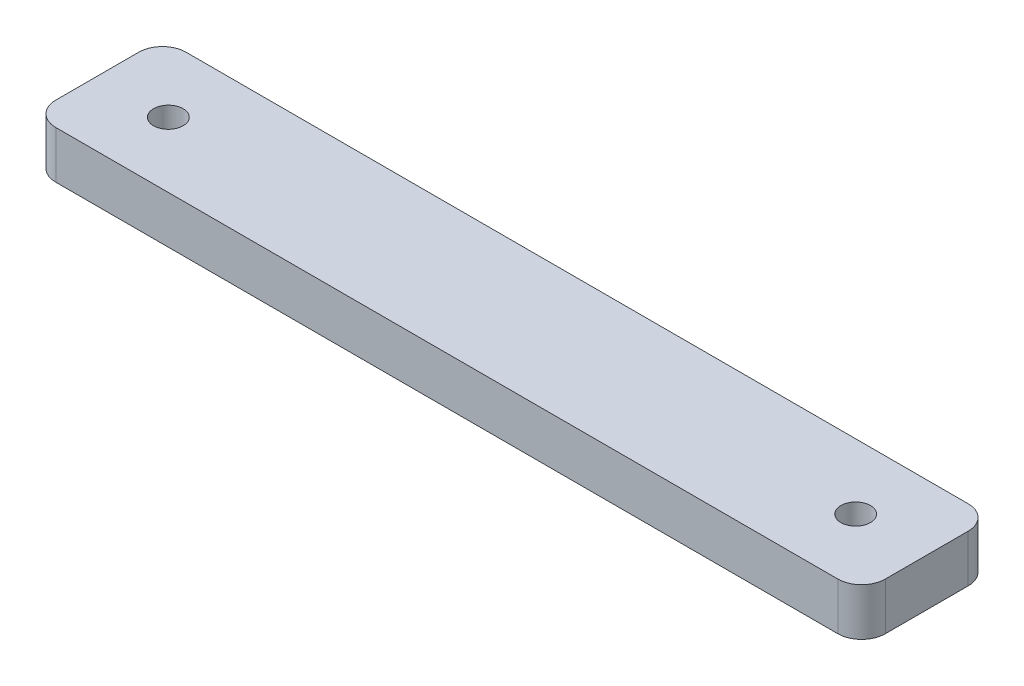
ISO-10303-21;
HEADER;
FILE_DESCRIPTION(('STEP AP214'),'2;1');
FILE_NAME('part.step','',(''),(''),'','','');
FILE_SCHEMA(('AUTOMOTIVE_DESIGN { 1 0 10303 214 1 1 1 1 }'));
ENDSEC;
DATA;
#1=APPLICATION_CONTEXT('core data for automotive mechanical design processes');
#2=APPLICATION_PROTOCOL_DEFINITION('international standard','automotive_design',2000,#1);
#3=PRODUCT_CONTEXT('',#1,'mechanical');
#4=PRODUCT('Part','Part','',(#3));
#5=PRODUCT_RELATED_PRODUCT_CATEGORY('part','',(#4));
#6=PRODUCT_DEFINITION_FORMATION('','',#4);
#7=PRODUCT_DEFINITION_CONTEXT('part definition',#1,'design');
#8=PRODUCT_DEFINITION('design','',#6,#7);
#9=PRODUCT_DEFINITION_SHAPE('','',#8);
#10=(LENGTH_UNIT() NAMED_UNIT(*) SI_UNIT(.MILLI.,.METRE.));
#11=(NAMED_UNIT(*) PLANE_ANGLE_UNIT() SI_UNIT($,.RADIAN.));
#12=(NAMED_UNIT(*) SI_UNIT($,.STERADIAN.) SOLID_ANGLE_UNIT());
#13=UNCERTAINTY_MEASURE_WITH_UNIT(LENGTH_MEASURE(1.E-05),#10,'distance_accuracy_value','');
#14=(GEOMETRIC_REPRESENTATION_CONTEXT(3) GLOBAL_UNCERTAINTY_ASSIGNED_CONTEXT((#13)) GLOBAL_UNIT_ASSIGNED_CONTEXT((#10,
#11,#12)) REPRESENTATION_CONTEXT('',''));
#15=CARTESIAN_POINT('',(0.,0.,0.));
#16=DIRECTION('',(0.,0.,1.));
#17=DIRECTION('',(1.,0.,0.));
#18=AXIS2_PLACEMENT_3D('',#15,#16,#17);
#19=CARTESIAN_POINT('',(0.,2.,0.));
#20=DIRECTION('',(0.,-1.,0.));
#21=DIRECTION('',(0.,0.,-1.));
#22=AXIS2_PLACEMENT_3D('',#19,#20,#21);
#23=PLANE('',#22);
#24=DIRECTION('',(0.,0.,-1.));
#25=VECTOR('',#24,1.);
#26=CARTESIAN_POINT('',(17.5,2.,2.75));
#27=LINE('',#26,#25);
#28=CARTESIAN_POINT('',(17.5,2.,1.75));
#29=VERTEX_POINT('',#28);
#30=CARTESIAN_POINT('',(17.5,2.,-1.75));
#31=VERTEX_POINT('',#30);
#32=EDGE_CURVE('E141',#29,#31,#27,.T.);
#33=ORIENTED_EDGE('',*,*,#32,.T.);
#34=CARTESIAN_POINT('',(16.5,2.,-1.75));
#35=DIRECTION('',(0.,-1.,0.));
#36=DIRECTION('',(0.,0.,-1.));
#37=AXIS2_PLACEMENT_3D('',#34,#35,#36);
#38=CIRCLE('',#37,1.);
#39=CARTESIAN_POINT('',(16.5,2.,-2.75));
#40=VERTEX_POINT('',#39);
#41=EDGE_CURVE('E155',#31,#40,#38,.F.);
#42=ORIENTED_EDGE('',*,*,#41,.T.);
#43=DIRECTION('',(-1.,0.,0.));
#44=VECTOR('',#43,1.);
#45=CARTESIAN_POINT('',(-17.5,2.,-2.75));
#46=LINE('',#45,#44);
#47=CARTESIAN_POINT('',(-16.5,2.,-2.75));
#48=VERTEX_POINT('',#47);
#49=EDGE_CURVE('E122',#40,#48,#46,.T.);
#50=ORIENTED_EDGE('',*,*,#49,.T.);
#51=CARTESIAN_POINT('',(-16.5,2.,-1.75));
#52=DIRECTION('',(0.,-1.,0.));
#53=DIRECTION('',(0.,0.,-1.));
#54=AXIS2_PLACEMENT_3D('',#51,#52,#53);
#55=CIRCLE('',#54,1.);
#56=CARTESIAN_POINT('',(-17.5,2.,-1.75));
#57=VERTEX_POINT('',#56);
#58=EDGE_CURVE('E151',#48,#57,#55,.F.);
#59=ORIENTED_EDGE('',*,*,#58,.T.);
#60=DIRECTION('',(0.,0.,1.));
#61=VECTOR('',#60,1.);
#62=CARTESIAN_POINT('',(-17.5,2.,2.75));
#63=LINE('',#62,#61);
#64=CARTESIAN_POINT('',(-17.5,2.,1.75));
#65=VERTEX_POINT('',#64);
#66=EDGE_CURVE('E164',#57,#65,#63,.T.);
#67=ORIENTED_EDGE('',*,*,#66,.T.);
#68=CARTESIAN_POINT('',(-16.5,2.,1.75));
#69=DIRECTION('',(0.,-1.,0.));
#70=DIRECTION('',(0.,0.,-1.));
#71=AXIS2_PLACEMENT_3D('',#68,#69,#70);
#72=CIRCLE('',#71,1.);
#73=CARTESIAN_POINT('',(-16.5,2.,2.75));
#74=VERTEX_POINT('',#73);
#75=EDGE_CURVE('E57',#65,#74,#72,.F.);
#76=ORIENTED_EDGE('',*,*,#75,.T.);
#77=DIRECTION('',(1.,0.,0.));
#78=VECTOR('',#77,1.);
#79=CARTESIAN_POINT('',(-17.5,2.,2.75));
#80=LINE('',#79,#78);
#81=CARTESIAN_POINT('',(16.5,2.,2.75));
#82=VERTEX_POINT('',#81);
#83=EDGE_CURVE('E142',#74,#82,#80,.T.);
#84=ORIENTED_EDGE('',*,*,#83,.T.);
#85=CARTESIAN_POINT('',(16.5,2.,1.75));
#86=DIRECTION('',(0.,-1.,0.));
#87=DIRECTION('',(0.,0.,-1.));
#88=AXIS2_PLACEMENT_3D('',#85,#86,#87);
#89=CIRCLE('',#88,1.);
#90=EDGE_CURVE('E153',#82,#29,#89,.F.);
#91=ORIENTED_EDGE('',*,*,#90,.T.);
#92=EDGE_LOOP('',(#33,#42,#50,#59,#67,#76,#84,#91));
#93=FACE_BOUND('',#92,.T.);
#94=CARTESIAN_POINT('',(-14.5,2.,0.));
#95=DIRECTION('',(0.,1.,0.));
#96=DIRECTION('',(0.,0.,1.));
#97=AXIS2_PLACEMENT_3D('',#94,#95,#96);
#98=CIRCLE('',#97,0.625000000000001);
#99=CARTESIAN_POINT('',(-14.5,2.,0.625000000000001));
#100=VERTEX_POINT('',#99);
#101=EDGE_CURVE('E136',#100,#100,#98,.T.);
#102=ORIENTED_EDGE('',*,*,#101,.F.);
#103=EDGE_LOOP('',(#102));
#104=FACE_BOUND('',#103,.T.);
#105=CARTESIAN_POINT('',(14.5,2.,0.));
#106=DIRECTION('',(0.,1.,0.));
#107=DIRECTION('',(0.,0.,-1.));
#108=AXIS2_PLACEMENT_3D('',#105,#106,#107);
#109=CIRCLE('',#108,0.625000000000001);
#110=CARTESIAN_POINT('',(14.5,2.,-0.625000000000001));
#111=VERTEX_POINT('',#110);
#112=EDGE_CURVE('E187',#111,#111,#109,.T.);
#113=ORIENTED_EDGE('',*,*,#112,.F.);
#114=EDGE_LOOP('',(#113));
#115=FACE_BOUND('',#114,.T.);
#116=ADVANCED_FACE('F35',(#93,#104,#115),#23,.F.);
#117=CARTESIAN_POINT('',(0.,0.,0.));
#118=DIRECTION('',(0.,-1.,0.));
#119=DIRECTION('',(0.,0.,-1.));
#120=AXIS2_PLACEMENT_3D('',#117,#118,#119);
#121=PLANE('',#120);
#122=CARTESIAN_POINT('',(-14.5,0.,0.));
#123=DIRECTION('',(0.,1.,0.));
#124=DIRECTION('',(0.,0.,1.));
#125=AXIS2_PLACEMENT_3D('',#122,#123,#124);
#126=CIRCLE('',#125,0.625000000000001);
#127=CARTESIAN_POINT('',(-14.5,0.,0.625000000000001));
#128=VERTEX_POINT('',#127);
#129=EDGE_CURVE('E184',#128,#128,#126,.T.);
#130=ORIENTED_EDGE('',*,*,#129,.T.);
#131=EDGE_LOOP('',(#130));
#132=FACE_BOUND('',#131,.T.);
#133=DIRECTION('',(-1.,0.,0.));
#134=VECTOR('',#133,1.);
#135=CARTESIAN_POINT('',(-17.5,0.,-2.75));
#136=LINE('',#135,#134);
#137=CARTESIAN_POINT('',(16.5,0.,-2.75));
#138=VERTEX_POINT('',#137);
#139=CARTESIAN_POINT('',(-16.5,0.,-2.75));
#140=VERTEX_POINT('',#139);
#141=EDGE_CURVE('E119',#138,#140,#136,.T.);
#142=ORIENTED_EDGE('',*,*,#141,.F.);
#143=CARTESIAN_POINT('',(16.5,0.,-1.75));
#144=DIRECTION('',(0.,-1.,0.));
#145=DIRECTION('',(0.,0.,-1.));
#146=AXIS2_PLACEMENT_3D('',#143,#144,#145);
#147=CIRCLE('',#146,1.);
#148=CARTESIAN_POINT('',(17.5,0.,-1.75));
#149=VERTEX_POINT('',#148);
#150=EDGE_CURVE('E102',#138,#149,#147,.T.);
#151=ORIENTED_EDGE('',*,*,#150,.T.);
#152=DIRECTION('',(0.,0.,-1.));
#153=VECTOR('',#152,1.);
#154=CARTESIAN_POINT('',(17.5,0.,2.75));
#155=LINE('',#154,#153);
#156=CARTESIAN_POINT('',(17.5,0.,1.75));
#157=VERTEX_POINT('',#156);
#158=EDGE_CURVE('E131',#157,#149,#155,.T.);
#159=ORIENTED_EDGE('',*,*,#158,.F.);
#160=CARTESIAN_POINT('',(16.5,0.,1.75));
#161=DIRECTION('',(0.,-1.,0.));
#162=DIRECTION('',(0.,0.,-1.));
#163=AXIS2_PLACEMENT_3D('',#160,#161,#162);
#164=CIRCLE('',#163,1.);
#165=CARTESIAN_POINT('',(16.5,0.,2.75));
#166=VERTEX_POINT('',#165);
#167=EDGE_CURVE('E113',#157,#166,#164,.T.);
#168=ORIENTED_EDGE('',*,*,#167,.T.);
#169=DIRECTION('',(1.,0.,0.));
#170=VECTOR('',#169,1.);
#171=CARTESIAN_POINT('',(-17.5,0.,2.75));
#172=LINE('',#171,#170);
#173=CARTESIAN_POINT('',(-16.5,0.,2.75));
#174=VERTEX_POINT('',#173);
#175=EDGE_CURVE('E134',#174,#166,#172,.T.);
#176=ORIENTED_EDGE('',*,*,#175,.F.);
#177=CARTESIAN_POINT('',(-16.5,0.,1.75));
#178=DIRECTION('',(0.,-1.,0.));
#179=DIRECTION('',(0.,0.,-1.));
#180=AXIS2_PLACEMENT_3D('',#177,#178,#179);
#181=CIRCLE('',#180,1.);
#182=CARTESIAN_POINT('',(-17.5,0.,1.75));
#183=VERTEX_POINT('',#182);
#184=EDGE_CURVE('E123',#174,#183,#181,.T.);
#185=ORIENTED_EDGE('',*,*,#184,.T.);
#186=DIRECTION('',(0.,0.,1.));
#187=VECTOR('',#186,1.);
#188=CARTESIAN_POINT('',(-17.5,0.,2.75));
#189=LINE('',#188,#187);
#190=CARTESIAN_POINT('',(-17.5,0.,-1.75));
#191=VERTEX_POINT('',#190);
#192=EDGE_CURVE('E130',#191,#183,#189,.T.);
#193=ORIENTED_EDGE('',*,*,#192,.F.);
#194=CARTESIAN_POINT('',(-16.5,0.,-1.75));
#195=DIRECTION('',(0.,-1.,0.));
#196=DIRECTION('',(0.,0.,-1.));
#197=AXIS2_PLACEMENT_3D('',#194,#195,#196);
#198=CIRCLE('',#197,1.);
#199=EDGE_CURVE('E129',#191,#140,#198,.T.);
#200=ORIENTED_EDGE('',*,*,#199,.T.);
#201=EDGE_LOOP('',(#142,#151,#159,#168,#176,#185,#193,#200));
#202=FACE_BOUND('',#201,.T.);
#203=CARTESIAN_POINT('',(14.5,0.,0.));
#204=DIRECTION('',(0.,1.,0.));
#205=DIRECTION('',(0.,0.,-1.));
#206=AXIS2_PLACEMENT_3D('',#203,#204,#205);
#207=CIRCLE('',#206,0.625000000000001);
#208=CARTESIAN_POINT('',(14.5,0.,-0.625000000000001));
#209=VERTEX_POINT('',#208);
#210=EDGE_CURVE('E190',#209,#209,#207,.T.);
#211=ORIENTED_EDGE('',*,*,#210,.T.);
#212=EDGE_LOOP('',(#211));
#213=FACE_BOUND('',#212,.T.);
#214=ADVANCED_FACE('F126',(#132,#202,#213),#121,.T.);
#215=CARTESIAN_POINT('',(17.5,2.,2.75));
#216=DIRECTION('',(-1.,0.,0.));
#217=DIRECTION('',(0.,0.,1.));
#218=AXIS2_PLACEMENT_3D('',#215,#216,#217);
#219=PLANE('',#218);
#220=ORIENTED_EDGE('',*,*,#158,.T.);
#221=DIRECTION('',(0.,-1.,0.));
#222=VECTOR('',#221,1.);
#223=CARTESIAN_POINT('',(17.5,2.,-1.75));
#224=LINE('',#223,#222);
#225=EDGE_CURVE('E107',#149,#31,#224,.F.);
#226=ORIENTED_EDGE('',*,*,#225,.T.);
#227=ORIENTED_EDGE('',*,*,#32,.F.);
#228=DIRECTION('',(0.,-1.,0.));
#229=VECTOR('',#228,1.);
#230=CARTESIAN_POINT('',(17.5,2.,1.75));
#231=LINE('',#230,#229);
#232=EDGE_CURVE('E112',#29,#157,#231,.T.);
#233=ORIENTED_EDGE('',*,*,#232,.T.);
#234=EDGE_LOOP('',(#220,#226,#227,#233));
#235=FACE_BOUND('',#234,.T.);
#236=ADVANCED_FACE('F180',(#235),#219,.F.);
#237=CARTESIAN_POINT('',(-17.5,2.,-2.75));
#238=DIRECTION('',(0.,0.,1.));
#239=DIRECTION('',(1.,0.,0.));
#240=AXIS2_PLACEMENT_3D('',#237,#238,#239);
#241=PLANE('',#240);
#242=ORIENTED_EDGE('',*,*,#49,.F.);
#243=DIRECTION('',(0.,-1.,0.));
#244=VECTOR('',#243,1.);
#245=CARTESIAN_POINT('',(16.5,2.,-2.75));
#246=LINE('',#245,#244);
#247=EDGE_CURVE('E106',#40,#138,#246,.T.);
#248=ORIENTED_EDGE('',*,*,#247,.T.);
#249=ORIENTED_EDGE('',*,*,#141,.T.);
#250=DIRECTION('',(0.,-1.,0.));
#251=VECTOR('',#250,1.);
#252=CARTESIAN_POINT('',(-16.5,2.,-2.75));
#253=LINE('',#252,#251);
#254=EDGE_CURVE('E124',#140,#48,#253,.F.);
#255=ORIENTED_EDGE('',*,*,#254,.T.);
#256=EDGE_LOOP('',(#242,#248,#249,#255));
#257=FACE_BOUND('',#256,.T.);
#258=ADVANCED_FACE('F118',(#257),#241,.F.);
#259=CARTESIAN_POINT('',(-17.5,2.,2.75));
#260=DIRECTION('',(1.,0.,0.));
#261=DIRECTION('',(0.,0.,-1.));
#262=AXIS2_PLACEMENT_3D('',#259,#260,#261);
#263=PLANE('',#262);
#264=ORIENTED_EDGE('',*,*,#66,.F.);
#265=DIRECTION('',(0.,-1.,0.));
#266=VECTOR('',#265,1.);
#267=CARTESIAN_POINT('',(-17.5,2.,-1.75));
#268=LINE('',#267,#266);
#269=EDGE_CURVE('E11',#57,#191,#268,.T.);
#270=ORIENTED_EDGE('',*,*,#269,.T.);
#271=ORIENTED_EDGE('',*,*,#192,.T.);
#272=DIRECTION('',(0.,-1.,0.));
#273=VECTOR('',#272,1.);
#274=CARTESIAN_POINT('',(-17.5,2.,1.75));
#275=LINE('',#274,#273);
#276=EDGE_CURVE('E43',#183,#65,#275,.F.);
#277=ORIENTED_EDGE('',*,*,#276,.T.);
#278=EDGE_LOOP('',(#264,#270,#271,#277));
#279=FACE_BOUND('',#278,.T.);
#280=ADVANCED_FACE('F163',(#279),#263,.F.);
#281=CARTESIAN_POINT('',(-17.5,2.,2.75));
#282=DIRECTION('',(0.,0.,-1.));
#283=DIRECTION('',(-1.,0.,0.));
#284=AXIS2_PLACEMENT_3D('',#281,#282,#283);
#285=PLANE('',#284);
#286=ORIENTED_EDGE('',*,*,#175,.T.);
#287=DIRECTION('',(0.,-1.,0.));
#288=VECTOR('',#287,1.);
#289=CARTESIAN_POINT('',(16.5,2.,2.75));
#290=LINE('',#289,#288);
#291=EDGE_CURVE('E50',#166,#82,#290,.F.);
#292=ORIENTED_EDGE('',*,*,#291,.T.);
#293=ORIENTED_EDGE('',*,*,#83,.F.);
#294=DIRECTION('',(0.,-1.,0.));
#295=VECTOR('',#294,1.);
#296=CARTESIAN_POINT('',(-16.5,2.,2.75));
#297=LINE('',#296,#295);
#298=EDGE_CURVE('E157',#74,#174,#297,.T.);
#299=ORIENTED_EDGE('',*,*,#298,.T.);
#300=EDGE_LOOP('',(#286,#292,#293,#299));
#301=FACE_BOUND('',#300,.T.);
#302=ADVANCED_FACE('F173',(#301),#285,.F.);
#303=CARTESIAN_POINT('',(-14.5,2.,0.));
#304=DIRECTION('',(0.,-1.,0.));
#305=DIRECTION('',(0.,0.,-1.));
#306=AXIS2_PLACEMENT_3D('',#303,#304,#305);
#307=CYLINDRICAL_SURFACE('',#306,0.625000000000001);
#308=ORIENTED_EDGE('',*,*,#101,.T.);
#309=EDGE_LOOP('',(#308));
#310=FACE_BOUND('',#309,.T.);
#311=ORIENTED_EDGE('',*,*,#129,.F.);
#312=EDGE_LOOP('',(#311));
#313=FACE_BOUND('',#312,.T.);
#314=ADVANCED_FACE('F207',(#310,#313),#307,.F.);
#315=CARTESIAN_POINT('',(14.5,2.,0.));
#316=DIRECTION('',(0.,-1.,0.));
#317=DIRECTION('',(0.,0.,-1.));
#318=AXIS2_PLACEMENT_3D('',#315,#316,#317);
#319=CYLINDRICAL_SURFACE('',#318,0.625000000000001);
#320=ORIENTED_EDGE('',*,*,#112,.T.);
#321=EDGE_LOOP('',(#320));
#322=FACE_BOUND('',#321,.T.);
#323=ORIENTED_EDGE('',*,*,#210,.F.);
#324=EDGE_LOOP('',(#323));
#325=FACE_BOUND('',#324,.T.);
#326=ADVANCED_FACE('F196',(#322,#325),#319,.F.);
#327=CARTESIAN_POINT('',(16.5,2.,-1.75));
#328=DIRECTION('',(0.,-1.,0.));
#329=DIRECTION('',(0.,0.,-1.));
#330=AXIS2_PLACEMENT_3D('',#327,#328,#329);
#331=CYLINDRICAL_SURFACE('',#330,1.);
#332=ORIENTED_EDGE('',*,*,#41,.F.);
#333=ORIENTED_EDGE('',*,*,#225,.F.);
#334=ORIENTED_EDGE('',*,*,#150,.F.);
#335=ORIENTED_EDGE('',*,*,#247,.F.);
#336=EDGE_LOOP('',(#332,#333,#334,#335));
#337=FACE_BOUND('',#336,.T.);
#338=ADVANCED_FACE('F105',(#337),#331,.T.);
#339=CARTESIAN_POINT('',(16.5,2.,1.75));
#340=DIRECTION('',(0.,-1.,0.));
#341=DIRECTION('',(0.,0.,-1.));
#342=AXIS2_PLACEMENT_3D('',#339,#340,#341);
#343=CYLINDRICAL_SURFACE('',#342,1.);
#344=ORIENTED_EDGE('',*,*,#90,.F.);
#345=ORIENTED_EDGE('',*,*,#291,.F.);
#346=ORIENTED_EDGE('',*,*,#167,.F.);
#347=ORIENTED_EDGE('',*,*,#232,.F.);
#348=EDGE_LOOP('',(#344,#345,#346,#347));
#349=FACE_BOUND('',#348,.T.);
#350=ADVANCED_FACE('F177',(#349),#343,.T.);
#351=CARTESIAN_POINT('',(-16.5,2.,-1.75));
#352=DIRECTION('',(0.,-1.,0.));
#353=DIRECTION('',(0.,0.,-1.));
#354=AXIS2_PLACEMENT_3D('',#351,#352,#353);
#355=CYLINDRICAL_SURFACE('',#354,1.);
#356=ORIENTED_EDGE('',*,*,#58,.F.);
#357=ORIENTED_EDGE('',*,*,#254,.F.);
#358=ORIENTED_EDGE('',*,*,#199,.F.);
#359=ORIENTED_EDGE('',*,*,#269,.F.);
#360=EDGE_LOOP('',(#356,#357,#358,#359));
#361=FACE_BOUND('',#360,.T.);
#362=ADVANCED_FACE('F221',(#361),#355,.T.);
#363=CARTESIAN_POINT('',(-16.5,2.,1.75));
#364=DIRECTION('',(0.,-1.,0.));
#365=DIRECTION('',(0.,0.,-1.));
#366=AXIS2_PLACEMENT_3D('',#363,#364,#365);
#367=CYLINDRICAL_SURFACE('',#366,1.);
#368=ORIENTED_EDGE('',*,*,#75,.F.);
#369=ORIENTED_EDGE('',*,*,#276,.F.);
#370=ORIENTED_EDGE('',*,*,#184,.F.);
#371=ORIENTED_EDGE('',*,*,#298,.F.);
#372=EDGE_LOOP('',(#368,#369,#370,#371));
#373=FACE_BOUND('',#372,.T.);
#374=ADVANCED_FACE('F37',(#373),#367,.T.);
#375=CLOSED_SHELL('',(#116,#214,#236,#258,#280,#302,#314,#326,#338,#350,#362,#374));
#376=MANIFOLD_SOLID_BREP('B2',#375);
#377=ADVANCED_BREP_SHAPE_REPRESENTATION('',(#18,#376),#14);
#378=SHAPE_DEFINITION_REPRESENTATION(#9,#377);
ENDSEC;
END-ISO-10303-21;
